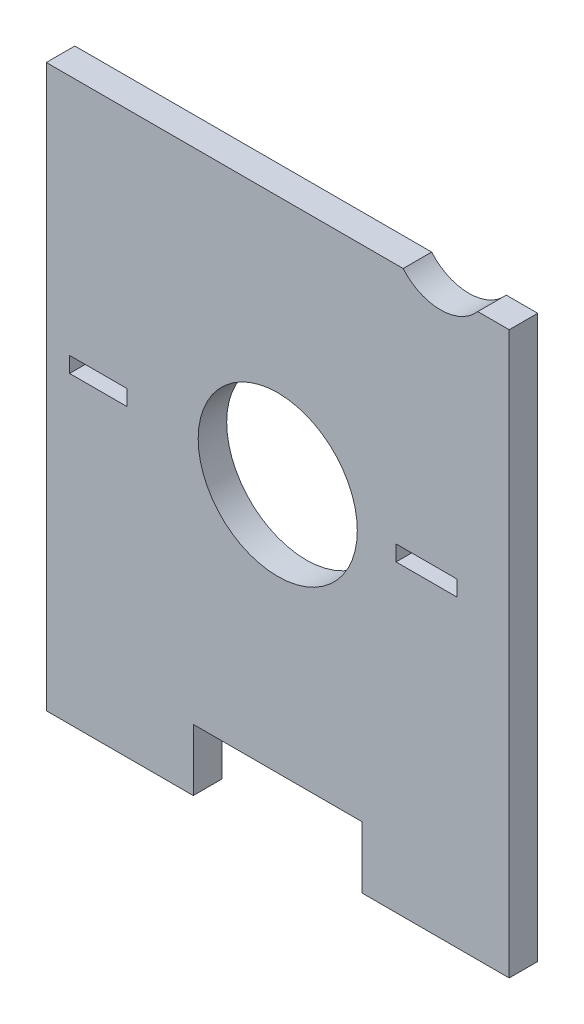
ISO-10303-21;
HEADER;
FILE_DESCRIPTION(('STEP AP214'),'2;1');
FILE_NAME('part.step','',(''),(''),'','','');
FILE_SCHEMA(('AUTOMOTIVE_DESIGN { 1 0 10303 214 1 1 1 1 }'));
ENDSEC;
DATA;
#1=APPLICATION_CONTEXT('core data for automotive mechanical design processes');
#2=APPLICATION_PROTOCOL_DEFINITION('international standard','automotive_design',2000,#1);
#3=PRODUCT_CONTEXT('',#1,'mechanical');
#4=PRODUCT('Part','Part','',(#3));
#5=PRODUCT_RELATED_PRODUCT_CATEGORY('part','',(#4));
#6=PRODUCT_DEFINITION_FORMATION('','',#4);
#7=PRODUCT_DEFINITION_CONTEXT('part definition',#1,'design');
#8=PRODUCT_DEFINITION('design','',#6,#7);
#9=PRODUCT_DEFINITION_SHAPE('','',#8);
#10=(LENGTH_UNIT() NAMED_UNIT(*) SI_UNIT(.MILLI.,.METRE.));
#11=(NAMED_UNIT(*) PLANE_ANGLE_UNIT() SI_UNIT($,.RADIAN.));
#12=(NAMED_UNIT(*) SI_UNIT($,.STERADIAN.) SOLID_ANGLE_UNIT());
#13=UNCERTAINTY_MEASURE_WITH_UNIT(LENGTH_MEASURE(1.E-05),#10,'distance_accuracy_value','');
#14=(GEOMETRIC_REPRESENTATION_CONTEXT(3) GLOBAL_UNCERTAINTY_ASSIGNED_CONTEXT((#13)) GLOBAL_UNIT_ASSIGNED_CONTEXT((#10,
#11,#12)) REPRESENTATION_CONTEXT('',''));
#15=CARTESIAN_POINT('',(0.,0.,0.));
#16=DIRECTION('',(0.,0.,1.));
#17=DIRECTION('',(1.,0.,0.));
#18=AXIS2_PLACEMENT_3D('',#15,#16,#17);
#19=CARTESIAN_POINT('',(0.,43.18,2.4638));
#20=DIRECTION('',(0.,-1.,0.));
#21=DIRECTION('',(0.,0.,-1.));
#22=AXIS2_PLACEMENT_3D('',#19,#20,#21);
#23=PLANE('',#22);
#24=DIRECTION('',(-1.,0.,0.));
#25=VECTOR('',#24,1.);
#26=CARTESIAN_POINT('',(0.,43.18,0.));
#27=LINE('',#26,#25);
#28=CARTESIAN_POINT('',(40.,43.18,0.));
#29=VERTEX_POINT('',#28);
#30=CARTESIAN_POINT('',(37.2830228705034,43.18,0.));
#31=VERTEX_POINT('',#30);
#32=EDGE_CURVE('E204',#29,#31,#27,.T.);
#33=ORIENTED_EDGE('',*,*,#32,.T.);
#34=DIRECTION('',(0.,0.,1.));
#35=VECTOR('',#34,1.);
#36=CARTESIAN_POINT('',(37.2830228705034,43.18,-5.00000000001367E-05));
#37=LINE('',#36,#35);
#38=CARTESIAN_POINT('',(37.2830228705034,43.18,2.4638));
#39=VERTEX_POINT('',#38);
#40=EDGE_CURVE('E48',#31,#39,#37,.T.);
#41=ORIENTED_EDGE('',*,*,#40,.T.);
#42=DIRECTION('',(-1.,0.,0.));
#43=VECTOR('',#42,1.);
#44=CARTESIAN_POINT('',(0.,43.18,2.4638));
#45=LINE('',#44,#43);
#46=CARTESIAN_POINT('',(40.,43.18,2.4638));
#47=VERTEX_POINT('',#46);
#48=EDGE_CURVE('E171',#47,#39,#45,.T.);
#49=ORIENTED_EDGE('',*,*,#48,.F.);
#50=DIRECTION('',(0.,0.,-1.));
#51=VECTOR('',#50,1.);
#52=CARTESIAN_POINT('',(40.,43.18,2.4638));
#53=LINE('',#52,#51);
#54=EDGE_CURVE('E194',#47,#29,#53,.T.);
#55=ORIENTED_EDGE('',*,*,#54,.T.);
#56=EDGE_LOOP('',(#33,#41,#49,#55));
#57=FACE_BOUND('',#56,.T.);
#58=ADVANCED_FACE('F34',(#57),#23,.F.);
#59=CARTESIAN_POINT('',(0.,0.,2.4638));
#60=DIRECTION('',(0.,1.,0.));
#61=DIRECTION('',(0.,0.,1.));
#62=AXIS2_PLACEMENT_3D('',#59,#60,#61);
#63=PLANE('',#62);
#64=DIRECTION('',(0.,0.,-1.));
#65=VECTOR('',#64,1.);
#66=CARTESIAN_POINT('',(27.3,0.,0.));
#67=LINE('',#66,#65);
#68=CARTESIAN_POINT('',(27.3,0.,2.4638));
#69=VERTEX_POINT('',#68);
#70=CARTESIAN_POINT('',(27.3,0.,0.));
#71=VERTEX_POINT('',#70);
#72=EDGE_CURVE('E225',#69,#71,#67,.T.);
#73=ORIENTED_EDGE('',*,*,#72,.F.);
#74=DIRECTION('',(1.,0.,0.));
#75=VECTOR('',#74,1.);
#76=CARTESIAN_POINT('',(0.,0.,2.4638));
#77=LINE('',#76,#75);
#78=CARTESIAN_POINT('',(12.7,0.,2.4638));
#79=VERTEX_POINT('',#78);
#80=EDGE_CURVE('E179',#79,#69,#77,.T.);
#81=ORIENTED_EDGE('',*,*,#80,.F.);
#82=DIRECTION('',(0.,0.,1.));
#83=VECTOR('',#82,1.);
#84=CARTESIAN_POINT('',(12.7,0.,0.));
#85=LINE('',#84,#83);
#86=CARTESIAN_POINT('',(12.7,0.,0.));
#87=VERTEX_POINT('',#86);
#88=EDGE_CURVE('E199',#87,#79,#85,.T.);
#89=ORIENTED_EDGE('',*,*,#88,.F.);
#90=DIRECTION('',(1.,0.,0.));
#91=VECTOR('',#90,1.);
#92=CARTESIAN_POINT('',(0.,0.,0.));
#93=LINE('',#92,#91);
#94=EDGE_CURVE('E185',#87,#71,#93,.T.);
#95=ORIENTED_EDGE('',*,*,#94,.T.);
#96=EDGE_LOOP('',(#73,#81,#89,#95));
#97=FACE_BOUND('',#96,.T.);
#98=ADVANCED_FACE('F353',(#97),#63,.F.);
#99=CARTESIAN_POINT('',(0.,0.,2.4638));
#100=DIRECTION('',(1.,0.,0.));
#101=DIRECTION('',(0.,1.,0.));
#102=AXIS2_PLACEMENT_3D('',#99,#100,#101);
#103=PLANE('',#102);
#104=DIRECTION('',(0.,-1.,0.));
#105=VECTOR('',#104,1.);
#106=CARTESIAN_POINT('',(0.,0.,0.));
#107=LINE('',#106,#105);
#108=CARTESIAN_POINT('',(0.,43.18,0.));
#109=VERTEX_POINT('',#108);
#110=CARTESIAN_POINT('',(0.,-5.334,0.));
#111=VERTEX_POINT('',#110);
#112=EDGE_CURVE('E183',#109,#111,#107,.T.);
#113=ORIENTED_EDGE('',*,*,#112,.T.);
#114=DIRECTION('',(0.,0.,-1.));
#115=VECTOR('',#114,1.);
#116=CARTESIAN_POINT('',(0.,-5.334,0.));
#117=LINE('',#116,#115);
#118=CARTESIAN_POINT('',(0.,-5.334,2.4638));
#119=VERTEX_POINT('',#118);
#120=EDGE_CURVE('E215',#119,#111,#117,.T.);
#121=ORIENTED_EDGE('',*,*,#120,.F.);
#122=DIRECTION('',(0.,-1.,0.));
#123=VECTOR('',#122,1.);
#124=CARTESIAN_POINT('',(0.,0.,2.4638));
#125=LINE('',#124,#123);
#126=CARTESIAN_POINT('',(0.,43.18,2.4638));
#127=VERTEX_POINT('',#126);
#128=EDGE_CURVE('E198',#127,#119,#125,.T.);
#129=ORIENTED_EDGE('',*,*,#128,.F.);
#130=DIRECTION('',(0.,0.,-1.));
#131=VECTOR('',#130,1.);
#132=CARTESIAN_POINT('',(0.,43.18,2.4638));
#133=LINE('',#132,#131);
#134=EDGE_CURVE('E175',#127,#109,#133,.T.);
#135=ORIENTED_EDGE('',*,*,#134,.T.);
#136=EDGE_LOOP('',(#113,#121,#129,#135));
#137=FACE_BOUND('',#136,.T.);
#138=ADVANCED_FACE('F36',(#137),#103,.F.);
#139=CARTESIAN_POINT('',(40.,0.,2.4638));
#140=DIRECTION('',(-1.,0.,0.));
#141=DIRECTION('',(0.,-1.,0.));
#142=AXIS2_PLACEMENT_3D('',#139,#140,#141);
#143=PLANE('',#142);
#144=DIRECTION('',(0.,1.,0.));
#145=VECTOR('',#144,1.);
#146=CARTESIAN_POINT('',(40.,0.,0.));
#147=LINE('',#146,#145);
#148=CARTESIAN_POINT('',(40.,-5.334,0.));
#149=VERTEX_POINT('',#148);
#150=EDGE_CURVE('E189',#149,#29,#147,.T.);
#151=ORIENTED_EDGE('',*,*,#150,.T.);
#152=ORIENTED_EDGE('',*,*,#54,.F.);
#153=DIRECTION('',(0.,1.,0.));
#154=VECTOR('',#153,1.);
#155=CARTESIAN_POINT('',(40.,0.,2.4638));
#156=LINE('',#155,#154);
#157=CARTESIAN_POINT('',(40.,-5.334,2.4638));
#158=VERTEX_POINT('',#157);
#159=EDGE_CURVE('E177',#158,#47,#156,.T.);
#160=ORIENTED_EDGE('',*,*,#159,.F.);
#161=DIRECTION('',(0.,0.,1.));
#162=VECTOR('',#161,1.);
#163=CARTESIAN_POINT('',(40.,-5.334,0.));
#164=LINE('',#163,#162);
#165=EDGE_CURVE('E228',#149,#158,#164,.T.);
#166=ORIENTED_EDGE('',*,*,#165,.F.);
#167=EDGE_LOOP('',(#151,#152,#160,#166));
#168=FACE_BOUND('',#167,.T.);
#169=ADVANCED_FACE('F361',(#168),#143,.F.);
#170=CARTESIAN_POINT('',(30.8369771294967,43.18,2.4638));
#171=VERTEX_POINT('',#170);
#172=EDGE_CURVE('E168',#171,#127,#45,.T.);
#173=ORIENTED_EDGE('',*,*,#172,.F.);
#174=DIRECTION('',(0.,0.,1.));
#175=VECTOR('',#174,1.);
#176=CARTESIAN_POINT('',(30.8369771294967,43.18,-5.00000000001367E-05));
#177=LINE('',#176,#175);
#178=CARTESIAN_POINT('',(30.8369771294967,43.18,0.));
#179=VERTEX_POINT('',#178);
#180=EDGE_CURVE('E157',#171,#179,#177,.F.);
#181=ORIENTED_EDGE('',*,*,#180,.T.);
#182=EDGE_CURVE('E285',#179,#109,#27,.T.);
#183=ORIENTED_EDGE('',*,*,#182,.T.);
#184=ORIENTED_EDGE('',*,*,#134,.F.);
#185=EDGE_LOOP('',(#173,#181,#183,#184));
#186=FACE_BOUND('',#185,.T.);
#187=ADVANCED_FACE('F173',(#186),#23,.F.);
#188=CARTESIAN_POINT('',(0.,0.,2.4638));
#189=DIRECTION('',(0.,0.,-1.));
#190=DIRECTION('',(-1.,0.,0.));
#191=AXIS2_PLACEMENT_3D('',#188,#189,#190);
#192=PLANE('',#191);
#193=CARTESIAN_POINT('',(20.,21.59,2.4638));
#194=DIRECTION('',(0.,0.,1.));
#195=DIRECTION('',(1.,0.,0.));
#196=AXIS2_PLACEMENT_3D('',#193,#194,#195);
#197=CIRCLE('',#196,6.875);
#198=CARTESIAN_POINT('',(26.875,21.59,2.4638));
#199=VERTEX_POINT('',#198);
#200=EDGE_CURVE('E276',#199,#199,#197,.T.);
#201=ORIENTED_EDGE('',*,*,#200,.F.);
#202=EDGE_LOOP('',(#201));
#203=FACE_BOUND('',#202,.T.);
#204=DIRECTION('',(0.,-1.,0.));
#205=VECTOR('',#204,1.);
#206=CARTESIAN_POINT('',(2.01269013915652,22.2657839669625,2.4638));
#207=LINE('',#206,#205);
#208=CARTESIAN_POINT('',(2.01269013915652,22.2657839669625,2.4638));
#209=VERTEX_POINT('',#208);
#210=CARTESIAN_POINT('',(2.01269013915652,20.9142160330375,2.4638));
#211=VERTEX_POINT('',#210);
#212=EDGE_CURVE('E271',#209,#211,#207,.T.);
#213=ORIENTED_EDGE('',*,*,#212,.F.);
#214=DIRECTION('',(-1.,0.,0.));
#215=VECTOR('',#214,1.);
#216=CARTESIAN_POINT('',(6.98730986084344,22.2657839669625,2.4638));
#217=LINE('',#216,#215);
#218=CARTESIAN_POINT('',(6.98730986084344,22.2657839669625,2.4638));
#219=VERTEX_POINT('',#218);
#220=EDGE_CURVE('E56',#219,#209,#217,.T.);
#221=ORIENTED_EDGE('',*,*,#220,.F.);
#222=DIRECTION('',(0.,1.,0.));
#223=VECTOR('',#222,1.);
#224=CARTESIAN_POINT('',(6.98730986084344,20.9142160330375,2.4638));
#225=LINE('',#224,#223);
#226=CARTESIAN_POINT('',(6.98730986084344,20.9142160330375,2.4638));
#227=VERTEX_POINT('',#226);
#228=EDGE_CURVE('E261',#227,#219,#225,.T.);
#229=ORIENTED_EDGE('',*,*,#228,.F.);
#230=DIRECTION('',(1.,0.,0.));
#231=VECTOR('',#230,1.);
#232=CARTESIAN_POINT('',(2.01269013915652,20.9142160330375,2.4638));
#233=LINE('',#232,#231);
#234=EDGE_CURVE('E268',#211,#227,#233,.T.);
#235=ORIENTED_EDGE('',*,*,#234,.F.);
#236=EDGE_LOOP('',(#213,#221,#229,#235));
#237=FACE_BOUND('',#236,.T.);
#238=DIRECTION('',(0.,1.,0.));
#239=VECTOR('',#238,1.);
#240=CARTESIAN_POINT('',(35.48526125159,20.9142160330375,2.4638));
#241=LINE('',#240,#239);
#242=CARTESIAN_POINT('',(35.48526125159,20.9142160330375,2.4638));
#243=VERTEX_POINT('',#242);
#244=CARTESIAN_POINT('',(35.48526125159,22.2657839669625,2.4638));
#245=VERTEX_POINT('',#244);
#246=EDGE_CURVE('E252',#243,#245,#241,.T.);
#247=ORIENTED_EDGE('',*,*,#246,.F.);
#248=DIRECTION('',(1.,0.,0.));
#249=VECTOR('',#248,1.);
#250=CARTESIAN_POINT('',(30.2236095229595,20.9142160330375,2.4638));
#251=LINE('',#250,#249);
#252=CARTESIAN_POINT('',(30.2236095229595,20.9142160330375,2.4638));
#253=VERTEX_POINT('',#252);
#254=EDGE_CURVE('E255',#253,#243,#251,.T.);
#255=ORIENTED_EDGE('',*,*,#254,.F.);
#256=DIRECTION('',(0.,-1.,0.));
#257=VECTOR('',#256,1.);
#258=CARTESIAN_POINT('',(30.2236095229595,22.2657839669625,2.4638));
#259=LINE('',#258,#257);
#260=CARTESIAN_POINT('',(30.2236095229595,22.2657839669625,2.4638));
#261=VERTEX_POINT('',#260);
#262=EDGE_CURVE('E242',#261,#253,#259,.T.);
#263=ORIENTED_EDGE('',*,*,#262,.F.);
#264=DIRECTION('',(-1.,0.,0.));
#265=VECTOR('',#264,1.);
#266=CARTESIAN_POINT('',(35.48526125159,22.2657839669625,2.4638));
#267=LINE('',#266,#265);
#268=EDGE_CURVE('E249',#245,#261,#267,.T.);
#269=ORIENTED_EDGE('',*,*,#268,.F.);
#270=EDGE_LOOP('',(#247,#255,#263,#269));
#271=FACE_BOUND('',#270,.T.);
#272=ORIENTED_EDGE('',*,*,#48,.T.);
#273=CARTESIAN_POINT('',(34.0600000000001,45.9426343544184,2.4638));
#274=DIRECTION('',(0.,0.,1.));
#275=DIRECTION('',(1.,0.,0.));
#276=AXIS2_PLACEMENT_3D('',#273,#274,#275);
#277=CIRCLE('',#276,4.245);
#278=EDGE_CURVE('E160',#171,#39,#277,.T.);
#279=ORIENTED_EDGE('',*,*,#278,.F.);
#280=ORIENTED_EDGE('',*,*,#172,.T.);
#281=ORIENTED_EDGE('',*,*,#128,.T.);
#282=DIRECTION('',(-1.,0.,0.));
#283=VECTOR('',#282,1.);
#284=CARTESIAN_POINT('',(0.,-5.334,2.4638));
#285=LINE('',#284,#283);
#286=CARTESIAN_POINT('',(12.7,-5.334,2.4638));
#287=VERTEX_POINT('',#286);
#288=EDGE_CURVE('E207',#287,#119,#285,.T.);
#289=ORIENTED_EDGE('',*,*,#288,.F.);
#290=DIRECTION('',(0.,1.,0.));
#291=VECTOR('',#290,1.);
#292=CARTESIAN_POINT('',(12.7,-5.334,2.4638));
#293=LINE('',#292,#291);
#294=EDGE_CURVE('E210',#287,#79,#293,.T.);
#295=ORIENTED_EDGE('',*,*,#294,.T.);
#296=ORIENTED_EDGE('',*,*,#80,.T.);
#297=DIRECTION('',(0.,1.,0.));
#298=VECTOR('',#297,1.);
#299=CARTESIAN_POINT('',(27.3,-5.334,2.4638));
#300=LINE('',#299,#298);
#301=CARTESIAN_POINT('',(27.3,-5.334,2.4638));
#302=VERTEX_POINT('',#301);
#303=EDGE_CURVE('E218',#302,#69,#300,.T.);
#304=ORIENTED_EDGE('',*,*,#303,.F.);
#305=DIRECTION('',(-1.,0.,0.));
#306=VECTOR('',#305,1.);
#307=CARTESIAN_POINT('',(40.,-5.334,2.4638));
#308=LINE('',#307,#306);
#309=EDGE_CURVE('E234',#158,#302,#308,.T.);
#310=ORIENTED_EDGE('',*,*,#309,.F.);
#311=ORIENTED_EDGE('',*,*,#159,.T.);
#312=EDGE_LOOP('',(#272,#279,#280,#281,#289,#295,#296,#304,#310,#311));
#313=FACE_BOUND('',#312,.T.);
#314=ADVANCED_FACE('F167',(#203,#237,#271,#313),#192,.F.);
#315=CARTESIAN_POINT('',(0.,0.,0.));
#316=DIRECTION('',(0.,0.,-1.));
#317=DIRECTION('',(-1.,0.,0.));
#318=AXIS2_PLACEMENT_3D('',#315,#316,#317);
#319=PLANE('',#318);
#320=CARTESIAN_POINT('',(34.0600000000001,45.9426343544184,0.));
#321=DIRECTION('',(0.,0.,-1.));
#322=DIRECTION('',(-1.,0.,0.));
#323=AXIS2_PLACEMENT_3D('',#320,#321,#322);
#324=CIRCLE('',#323,4.245);
#325=EDGE_CURVE('E11',#31,#179,#324,.T.);
#326=ORIENTED_EDGE('',*,*,#325,.F.);
#327=ORIENTED_EDGE('',*,*,#32,.F.);
#328=ORIENTED_EDGE('',*,*,#150,.F.);
#329=DIRECTION('',(1.,0.,0.));
#330=VECTOR('',#329,1.);
#331=CARTESIAN_POINT('',(40.,-5.334,0.));
#332=LINE('',#331,#330);
#333=CARTESIAN_POINT('',(27.3,-5.334,0.));
#334=VERTEX_POINT('',#333);
#335=EDGE_CURVE('E224',#334,#149,#332,.T.);
#336=ORIENTED_EDGE('',*,*,#335,.F.);
#337=DIRECTION('',(0.,1.,0.));
#338=VECTOR('',#337,1.);
#339=CARTESIAN_POINT('',(27.3,-5.334,0.));
#340=LINE('',#339,#338);
#341=EDGE_CURVE('E221',#334,#71,#340,.T.);
#342=ORIENTED_EDGE('',*,*,#341,.T.);
#343=ORIENTED_EDGE('',*,*,#94,.F.);
#344=DIRECTION('',(0.,1.,0.));
#345=VECTOR('',#344,1.);
#346=CARTESIAN_POINT('',(12.7,-5.334,0.));
#347=LINE('',#346,#345);
#348=CARTESIAN_POINT('',(12.7,-5.334,0.));
#349=VERTEX_POINT('',#348);
#350=EDGE_CURVE('E186',#349,#87,#347,.T.);
#351=ORIENTED_EDGE('',*,*,#350,.F.);
#352=DIRECTION('',(1.,0.,0.));
#353=VECTOR('',#352,1.);
#354=CARTESIAN_POINT('',(0.,-5.334,0.));
#355=LINE('',#354,#353);
#356=EDGE_CURVE('E213',#111,#349,#355,.T.);
#357=ORIENTED_EDGE('',*,*,#356,.F.);
#358=ORIENTED_EDGE('',*,*,#112,.F.);
#359=ORIENTED_EDGE('',*,*,#182,.F.);
#360=EDGE_LOOP('',(#326,#327,#328,#336,#342,#343,#351,#357,#358,#359));
#361=FACE_BOUND('',#360,.T.);
#362=CARTESIAN_POINT('',(20.,21.59,0.));
#363=DIRECTION('',(0.,0.,-1.));
#364=DIRECTION('',(-1.,0.,0.));
#365=AXIS2_PLACEMENT_3D('',#362,#363,#364);
#366=CIRCLE('',#365,6.875);
#367=CARTESIAN_POINT('',(13.125,21.59,0.));
#368=VERTEX_POINT('',#367);
#369=EDGE_CURVE('E275',#368,#368,#366,.T.);
#370=ORIENTED_EDGE('',*,*,#369,.F.);
#371=EDGE_LOOP('',(#370));
#372=FACE_BOUND('',#371,.T.);
#373=DIRECTION('',(1.,0.,0.));
#374=VECTOR('',#373,1.);
#375=CARTESIAN_POINT('',(0.,22.2657839669625,0.));
#376=LINE('',#375,#374);
#377=CARTESIAN_POINT('',(2.01269013915652,22.2657839669625,0.));
#378=VERTEX_POINT('',#377);
#379=CARTESIAN_POINT('',(6.98730986084344,22.2657839669625,0.));
#380=VERTEX_POINT('',#379);
#381=EDGE_CURVE('E42',#378,#380,#376,.T.);
#382=ORIENTED_EDGE('',*,*,#381,.F.);
#383=DIRECTION('',(0.,1.,0.));
#384=VECTOR('',#383,1.);
#385=CARTESIAN_POINT('',(2.01269013915652,0.,0.));
#386=LINE('',#385,#384);
#387=CARTESIAN_POINT('',(2.01269013915652,20.9142160330375,0.));
#388=VERTEX_POINT('',#387);
#389=EDGE_CURVE('E304',#388,#378,#386,.T.);
#390=ORIENTED_EDGE('',*,*,#389,.F.);
#391=DIRECTION('',(-1.,0.,0.));
#392=VECTOR('',#391,1.);
#393=CARTESIAN_POINT('',(0.,20.9142160330375,0.));
#394=LINE('',#393,#392);
#395=CARTESIAN_POINT('',(6.98730986084344,20.9142160330375,0.));
#396=VERTEX_POINT('',#395);
#397=EDGE_CURVE('E306',#396,#388,#394,.T.);
#398=ORIENTED_EDGE('',*,*,#397,.F.);
#399=DIRECTION('',(0.,-1.,0.));
#400=VECTOR('',#399,1.);
#401=CARTESIAN_POINT('',(6.98730986084344,0.,0.));
#402=LINE('',#401,#400);
#403=EDGE_CURVE('E309',#380,#396,#402,.T.);
#404=ORIENTED_EDGE('',*,*,#403,.F.);
#405=EDGE_LOOP('',(#382,#390,#398,#404));
#406=FACE_BOUND('',#405,.T.);
#407=DIRECTION('',(-1.,0.,0.));
#408=VECTOR('',#407,1.);
#409=CARTESIAN_POINT('',(0.,20.9142160330375,0.));
#410=LINE('',#409,#408);
#411=CARTESIAN_POINT('',(35.48526125159,20.9142160330375,0.));
#412=VERTEX_POINT('',#411);
#413=CARTESIAN_POINT('',(30.2236095229595,20.9142160330375,0.));
#414=VERTEX_POINT('',#413);
#415=EDGE_CURVE('E302',#412,#414,#410,.T.);
#416=ORIENTED_EDGE('',*,*,#415,.F.);
#417=DIRECTION('',(0.,-1.,0.));
#418=VECTOR('',#417,1.);
#419=CARTESIAN_POINT('',(35.48526125159,0.,0.));
#420=LINE('',#419,#418);
#421=CARTESIAN_POINT('',(35.48526125159,22.2657839669625,0.));
#422=VERTEX_POINT('',#421);
#423=EDGE_CURVE('E288',#422,#412,#420,.T.);
#424=ORIENTED_EDGE('',*,*,#423,.F.);
#425=DIRECTION('',(1.,0.,0.));
#426=VECTOR('',#425,1.);
#427=CARTESIAN_POINT('',(0.,22.2657839669625,0.));
#428=LINE('',#427,#426);
#429=CARTESIAN_POINT('',(30.2236095229595,22.2657839669625,0.));
#430=VERTEX_POINT('',#429);
#431=EDGE_CURVE('E289',#430,#422,#428,.T.);
#432=ORIENTED_EDGE('',*,*,#431,.F.);
#433=DIRECTION('',(0.,1.,0.));
#434=VECTOR('',#433,1.);
#435=CARTESIAN_POINT('',(30.2236095229595,0.,0.));
#436=LINE('',#435,#434);
#437=EDGE_CURVE('E295',#414,#430,#436,.T.);
#438=ORIENTED_EDGE('',*,*,#437,.F.);
#439=EDGE_LOOP('',(#416,#424,#432,#438));
#440=FACE_BOUND('',#439,.T.);
#441=ADVANCED_FACE('F317',(#361,#372,#406,#440),#319,.T.);
#442=CARTESIAN_POINT('',(12.7,-5.334,0.));
#443=DIRECTION('',(-1.,0.,0.));
#444=DIRECTION('',(0.,0.,1.));
#445=AXIS2_PLACEMENT_3D('',#442,#443,#444);
#446=PLANE('',#445);
#447=ORIENTED_EDGE('',*,*,#88,.T.);
#448=ORIENTED_EDGE('',*,*,#294,.F.);
#449=DIRECTION('',(0.,0.,1.));
#450=VECTOR('',#449,1.);
#451=CARTESIAN_POINT('',(12.7,-5.334,0.));
#452=LINE('',#451,#450);
#453=EDGE_CURVE('E211',#349,#287,#452,.T.);
#454=ORIENTED_EDGE('',*,*,#453,.F.);
#455=ORIENTED_EDGE('',*,*,#350,.T.);
#456=EDGE_LOOP('',(#447,#448,#454,#455));
#457=FACE_BOUND('',#456,.T.);
#458=ADVANCED_FACE('F320',(#457),#446,.F.);
#459=CARTESIAN_POINT('',(0.,-5.334,0.));
#460=DIRECTION('',(0.,1.,0.));
#461=DIRECTION('',(0.,0.,1.));
#462=AXIS2_PLACEMENT_3D('',#459,#460,#461);
#463=PLANE('',#462);
#464=ORIENTED_EDGE('',*,*,#120,.T.);
#465=ORIENTED_EDGE('',*,*,#356,.T.);
#466=ORIENTED_EDGE('',*,*,#453,.T.);
#467=ORIENTED_EDGE('',*,*,#288,.T.);
#468=EDGE_LOOP('',(#464,#465,#466,#467));
#469=FACE_BOUND('',#468,.T.);
#470=ADVANCED_FACE('F396',(#469),#463,.F.);
#471=CARTESIAN_POINT('',(27.3,-5.334,0.));
#472=DIRECTION('',(1.,0.,0.));
#473=DIRECTION('',(0.,0.,-1.));
#474=AXIS2_PLACEMENT_3D('',#471,#472,#473);
#475=PLANE('',#474);
#476=ORIENTED_EDGE('',*,*,#72,.T.);
#477=ORIENTED_EDGE('',*,*,#341,.F.);
#478=DIRECTION('',(0.,0.,-1.));
#479=VECTOR('',#478,1.);
#480=CARTESIAN_POINT('',(27.3,-5.334,0.));
#481=LINE('',#480,#479);
#482=EDGE_CURVE('E232',#302,#334,#481,.T.);
#483=ORIENTED_EDGE('',*,*,#482,.F.);
#484=ORIENTED_EDGE('',*,*,#303,.T.);
#485=EDGE_LOOP('',(#476,#477,#483,#484));
#486=FACE_BOUND('',#485,.T.);
#487=ADVANCED_FACE('F381',(#486),#475,.F.);
#488=CARTESIAN_POINT('',(0.,-5.334,0.));
#489=DIRECTION('',(0.,-1.,0.));
#490=DIRECTION('',(0.,0.,-1.));
#491=AXIS2_PLACEMENT_3D('',#488,#489,#490);
#492=PLANE('',#491);
#493=ORIENTED_EDGE('',*,*,#165,.T.);
#494=ORIENTED_EDGE('',*,*,#309,.T.);
#495=ORIENTED_EDGE('',*,*,#482,.T.);
#496=ORIENTED_EDGE('',*,*,#335,.T.);
#497=EDGE_LOOP('',(#493,#494,#495,#496));
#498=FACE_BOUND('',#497,.T.);
#499=ADVANCED_FACE('F375',(#498),#492,.T.);
#500=CARTESIAN_POINT('',(30.2236095229595,20.9142160330375,-5.00000000001367E-05));
#501=DIRECTION('',(0.,-1.,0.));
#502=DIRECTION('',(0.,0.,-1.));
#503=AXIS2_PLACEMENT_3D('',#500,#501,#502);
#504=PLANE('',#503);
#505=ORIENTED_EDGE('',*,*,#415,.T.);
#506=DIRECTION('',(0.,0.,1.));
#507=VECTOR('',#506,1.);
#508=CARTESIAN_POINT('',(30.2236095229595,20.9142160330375,-5.00000000001367E-05));
#509=LINE('',#508,#507);
#510=EDGE_CURVE('E229',#414,#253,#509,.T.);
#511=ORIENTED_EDGE('',*,*,#510,.T.);
#512=ORIENTED_EDGE('',*,*,#254,.T.);
#513=DIRECTION('',(0.,0.,1.));
#514=VECTOR('',#513,1.);
#515=CARTESIAN_POINT('',(35.48526125159,20.9142160330375,-5.00000000001367E-05));
#516=LINE('',#515,#514);
#517=EDGE_CURVE('E238',#412,#243,#516,.T.);
#518=ORIENTED_EDGE('',*,*,#517,.F.);
#519=EDGE_LOOP('',(#505,#511,#512,#518));
#520=FACE_BOUND('',#519,.T.);
#521=ADVANCED_FACE('F331',(#520),#504,.F.);
#522=CARTESIAN_POINT('',(30.2236095229595,22.2657839669625,-5.00000000001367E-05));
#523=DIRECTION('',(-1.,0.,0.));
#524=DIRECTION('',(0.,0.,1.));
#525=AXIS2_PLACEMENT_3D('',#522,#523,#524);
#526=PLANE('',#525);
#527=ORIENTED_EDGE('',*,*,#437,.T.);
#528=DIRECTION('',(0.,0.,1.));
#529=VECTOR('',#528,1.);
#530=CARTESIAN_POINT('',(30.2236095229595,22.2657839669625,-5.00000000001367E-05));
#531=LINE('',#530,#529);
#532=EDGE_CURVE('E244',#430,#261,#531,.T.);
#533=ORIENTED_EDGE('',*,*,#532,.T.);
#534=ORIENTED_EDGE('',*,*,#262,.T.);
#535=ORIENTED_EDGE('',*,*,#510,.F.);
#536=EDGE_LOOP('',(#527,#533,#534,#535));
#537=FACE_BOUND('',#536,.T.);
#538=ADVANCED_FACE('F333',(#537),#526,.F.);
#539=CARTESIAN_POINT('',(35.48526125159,22.2657839669625,-5.00000000001367E-05));
#540=DIRECTION('',(0.,1.,0.));
#541=DIRECTION('',(0.,0.,1.));
#542=AXIS2_PLACEMENT_3D('',#539,#540,#541);
#543=PLANE('',#542);
#544=ORIENTED_EDGE('',*,*,#431,.T.);
#545=DIRECTION('',(0.,0.,1.));
#546=VECTOR('',#545,1.);
#547=CARTESIAN_POINT('',(35.48526125159,22.2657839669625,-5.00000000001367E-05));
#548=LINE('',#547,#546);
#549=EDGE_CURVE('E241',#422,#245,#548,.T.);
#550=ORIENTED_EDGE('',*,*,#549,.T.);
#551=ORIENTED_EDGE('',*,*,#268,.T.);
#552=ORIENTED_EDGE('',*,*,#532,.F.);
#553=EDGE_LOOP('',(#544,#550,#551,#552));
#554=FACE_BOUND('',#553,.T.);
#555=ADVANCED_FACE('F342',(#554),#543,.F.);
#556=CARTESIAN_POINT('',(35.48526125159,20.9142160330375,-5.00000000001367E-05));
#557=DIRECTION('',(1.,0.,0.));
#558=DIRECTION('',(0.,0.,-1.));
#559=AXIS2_PLACEMENT_3D('',#556,#557,#558);
#560=PLANE('',#559);
#561=ORIENTED_EDGE('',*,*,#423,.T.);
#562=ORIENTED_EDGE('',*,*,#517,.T.);
#563=ORIENTED_EDGE('',*,*,#246,.T.);
#564=ORIENTED_EDGE('',*,*,#549,.F.);
#565=EDGE_LOOP('',(#561,#562,#563,#564));
#566=FACE_BOUND('',#565,.T.);
#567=ADVANCED_FACE('F340',(#566),#560,.F.);
#568=CARTESIAN_POINT('',(6.98730986084344,22.2657839669625,-5.00000000001367E-05));
#569=DIRECTION('',(0.,1.,0.));
#570=DIRECTION('',(0.,0.,1.));
#571=AXIS2_PLACEMENT_3D('',#568,#569,#570);
#572=PLANE('',#571);
#573=ORIENTED_EDGE('',*,*,#381,.T.);
#574=DIRECTION('',(0.,0.,1.));
#575=VECTOR('',#574,1.);
#576=CARTESIAN_POINT('',(6.98730986084344,22.2657839669625,-5.00000000001367E-05));
#577=LINE('',#576,#575);
#578=EDGE_CURVE('E257',#380,#219,#577,.T.);
#579=ORIENTED_EDGE('',*,*,#578,.T.);
#580=ORIENTED_EDGE('',*,*,#220,.T.);
#581=DIRECTION('',(0.,0.,1.));
#582=VECTOR('',#581,1.);
#583=CARTESIAN_POINT('',(2.01269013915652,22.2657839669625,-5.00000000001367E-05));
#584=LINE('',#583,#582);
#585=EDGE_CURVE('E258',#378,#209,#584,.T.);
#586=ORIENTED_EDGE('',*,*,#585,.F.);
#587=EDGE_LOOP('',(#573,#579,#580,#586));
#588=FACE_BOUND('',#587,.T.);
#589=ADVANCED_FACE('F349',(#588),#572,.F.);
#590=CARTESIAN_POINT('',(6.98730986084344,20.9142160330375,-5.00000000001367E-05));
#591=DIRECTION('',(1.,0.,0.));
#592=DIRECTION('',(0.,0.,-1.));
#593=AXIS2_PLACEMENT_3D('',#590,#591,#592);
#594=PLANE('',#593);
#595=ORIENTED_EDGE('',*,*,#403,.T.);
#596=DIRECTION('',(0.,0.,1.));
#597=VECTOR('',#596,1.);
#598=CARTESIAN_POINT('',(6.98730986084344,20.9142160330375,-5.00000000001367E-05));
#599=LINE('',#598,#597);
#600=EDGE_CURVE('E263',#396,#227,#599,.T.);
#601=ORIENTED_EDGE('',*,*,#600,.T.);
#602=ORIENTED_EDGE('',*,*,#228,.T.);
#603=ORIENTED_EDGE('',*,*,#578,.F.);
#604=EDGE_LOOP('',(#595,#601,#602,#603));
#605=FACE_BOUND('',#604,.T.);
#606=ADVANCED_FACE('F436',(#605),#594,.F.);
#607=CARTESIAN_POINT('',(2.01269013915652,20.9142160330375,-5.00000000001367E-05));
#608=DIRECTION('',(0.,-1.,0.));
#609=DIRECTION('',(0.,0.,-1.));
#610=AXIS2_PLACEMENT_3D('',#607,#608,#609);
#611=PLANE('',#610);
#612=ORIENTED_EDGE('',*,*,#397,.T.);
#613=DIRECTION('',(0.,0.,1.));
#614=VECTOR('',#613,1.);
#615=CARTESIAN_POINT('',(2.01269013915652,20.9142160330375,-5.00000000001367E-05));
#616=LINE('',#615,#614);
#617=EDGE_CURVE('E260',#388,#211,#616,.T.);
#618=ORIENTED_EDGE('',*,*,#617,.T.);
#619=ORIENTED_EDGE('',*,*,#234,.T.);
#620=ORIENTED_EDGE('',*,*,#600,.F.);
#621=EDGE_LOOP('',(#612,#618,#619,#620));
#622=FACE_BOUND('',#621,.T.);
#623=ADVANCED_FACE('F445',(#622),#611,.F.);
#624=CARTESIAN_POINT('',(2.01269013915652,22.2657839669625,-5.00000000001367E-05));
#625=DIRECTION('',(-1.,0.,0.));
#626=DIRECTION('',(0.,0.,1.));
#627=AXIS2_PLACEMENT_3D('',#624,#625,#626);
#628=PLANE('',#627);
#629=ORIENTED_EDGE('',*,*,#389,.T.);
#630=ORIENTED_EDGE('',*,*,#585,.T.);
#631=ORIENTED_EDGE('',*,*,#212,.T.);
#632=ORIENTED_EDGE('',*,*,#617,.F.);
#633=EDGE_LOOP('',(#629,#630,#631,#632));
#634=FACE_BOUND('',#633,.T.);
#635=ADVANCED_FACE('F455',(#634),#628,.F.);
#636=CARTESIAN_POINT('',(20.,21.59,-5.00000000001367E-05));
#637=DIRECTION('',(0.,0.,1.));
#638=DIRECTION('',(1.,0.,0.));
#639=AXIS2_PLACEMENT_3D('',#636,#637,#638);
#640=CYLINDRICAL_SURFACE('',#639,6.875);
#641=ORIENTED_EDGE('',*,*,#369,.T.);
#642=EDGE_LOOP('',(#641));
#643=FACE_BOUND('',#642,.T.);
#644=ORIENTED_EDGE('',*,*,#200,.T.);
#645=EDGE_LOOP('',(#644));
#646=FACE_BOUND('',#645,.T.);
#647=ADVANCED_FACE('F314',(#643,#646),#640,.F.);
#648=CARTESIAN_POINT('',(34.0600000000001,45.9426343544184,-5.00000000001367E-05));
#649=DIRECTION('',(0.,0.,1.));
#650=DIRECTION('',(1.,0.,0.));
#651=AXIS2_PLACEMENT_3D('',#648,#649,#650);
#652=CYLINDRICAL_SURFACE('',#651,4.245);
#653=ORIENTED_EDGE('',*,*,#325,.T.);
#654=ORIENTED_EDGE('',*,*,#180,.F.);
#655=ORIENTED_EDGE('',*,*,#278,.T.);
#656=ORIENTED_EDGE('',*,*,#40,.F.);
#657=EDGE_LOOP('',(#653,#654,#655,#656));
#658=FACE_BOUND('',#657,.T.);
#659=ADVANCED_FACE('F159',(#658),#652,.F.);
#660=CLOSED_SHELL('',(#58,#98,#138,#169,#187,#314,#441,#458,#470,#487,#499,#521,#538,#555,#567,
#589,#606,#623,#635,#647,#659));
#661=MANIFOLD_SOLID_BREP('B2',#660);
#662=ADVANCED_BREP_SHAPE_REPRESENTATION('',(#18,#661),#14);
#663=SHAPE_DEFINITION_REPRESENTATION(#9,#662);
ENDSEC;
END-ISO-10303-21;
